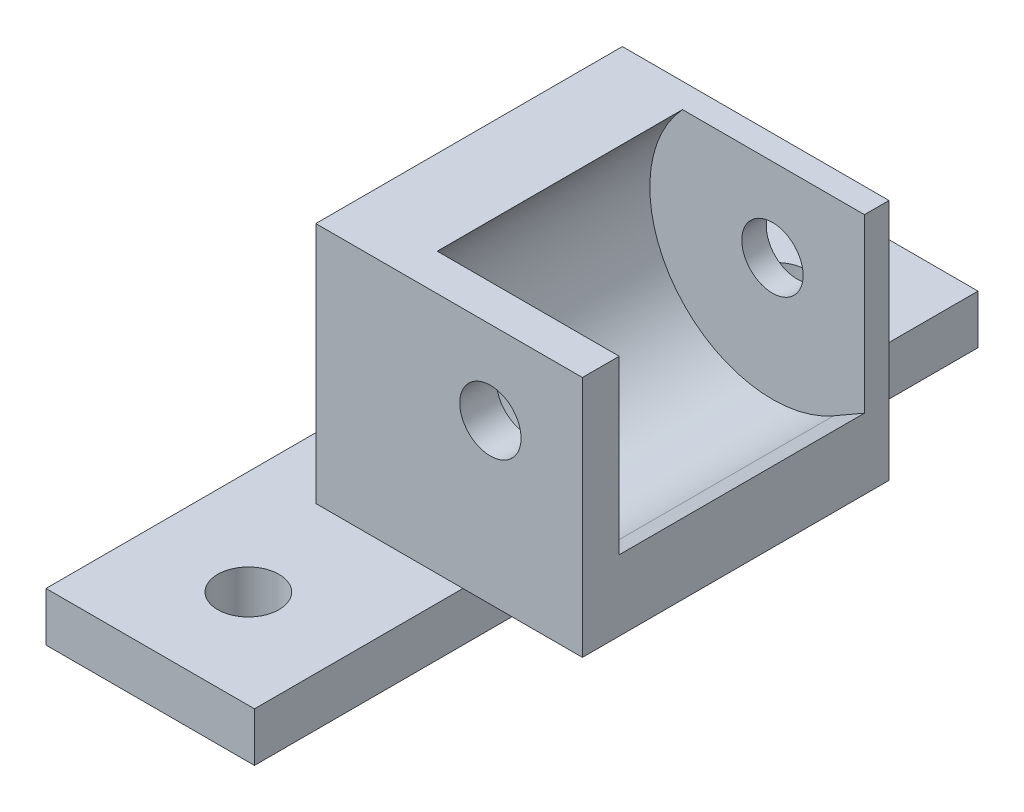
ISO-10303-21;
HEADER;
FILE_DESCRIPTION(('STEP AP214'),'2;1');
FILE_NAME('part.step','',(''),(''),'','','');
FILE_SCHEMA(('AUTOMOTIVE_DESIGN { 1 0 10303 214 1 1 1 1 }'));
ENDSEC;
DATA;
#1=APPLICATION_CONTEXT('core data for automotive mechanical design processes');
#2=APPLICATION_PROTOCOL_DEFINITION('international standard','automotive_design',2000,#1);
#3=PRODUCT_CONTEXT('',#1,'mechanical');
#4=PRODUCT('Part','Part','',(#3));
#5=PRODUCT_RELATED_PRODUCT_CATEGORY('part','',(#4));
#6=PRODUCT_DEFINITION_FORMATION('','',#4);
#7=PRODUCT_DEFINITION_CONTEXT('part definition',#1,'design');
#8=PRODUCT_DEFINITION('design','',#6,#7);
#9=PRODUCT_DEFINITION_SHAPE('','',#8);
#10=(LENGTH_UNIT() NAMED_UNIT(*) SI_UNIT(.MILLI.,.METRE.));
#11=(NAMED_UNIT(*) PLANE_ANGLE_UNIT() SI_UNIT($,.RADIAN.));
#12=(NAMED_UNIT(*) SI_UNIT($,.STERADIAN.) SOLID_ANGLE_UNIT());
#13=UNCERTAINTY_MEASURE_WITH_UNIT(LENGTH_MEASURE(1.E-05),#10,'distance_accuracy_value','');
#14=(GEOMETRIC_REPRESENTATION_CONTEXT(3) GLOBAL_UNCERTAINTY_ASSIGNED_CONTEXT((#13)) GLOBAL_UNIT_ASSIGNED_CONTEXT((#10,
#11,#12)) REPRESENTATION_CONTEXT('',''));
#15=CARTESIAN_POINT('',(0.,0.,0.));
#16=DIRECTION('',(0.,0.,1.));
#17=DIRECTION('',(1.,0.,0.));
#18=AXIS2_PLACEMENT_3D('',#15,#16,#17);
#19=CARTESIAN_POINT('',(-509.64503003972,340.,-27.94));
#20=DIRECTION('',(0.,0.,1.));
#21=DIRECTION('',(1.,0.,0.));
#22=AXIS2_PLACEMENT_3D('',#19,#20,#21);
#23=CYLINDRICAL_SURFACE('',#22,12.7);
#24=CARTESIAN_POINT('',(-509.64503003972,340.,-25.4000000000001));
#25=DIRECTION('',(0.,0.,-1.));
#26=DIRECTION('',(-1.,0.,0.));
#27=AXIS2_PLACEMENT_3D('',#24,#25,#26);
#28=CIRCLE('',#27,12.7);
#29=CARTESIAN_POINT('',(-503.315891549761,328.989459324133,-25.4000000000001));
#30=VERTEX_POINT('',#29);
#31=CARTESIAN_POINT('',(-518.959059009132,348.633589309028,-25.4000000000001));
#32=VERTEX_POINT('',#31);
#33=EDGE_CURVE('E152',#30,#32,#28,.T.);
#34=ORIENTED_EDGE('',*,*,#33,.T.);
#35=DIRECTION('',(0.,0.,1.));
#36=VECTOR('',#35,1.);
#37=CARTESIAN_POINT('',(-518.959059009132,348.633589309028,-27.94));
#38=LINE('',#37,#36);
#39=CARTESIAN_POINT('',(-518.959059009132,348.633589309028,0.));
#40=VERTEX_POINT('',#39);
#41=EDGE_CURVE('E63',#32,#40,#38,.T.);
#42=ORIENTED_EDGE('',*,*,#41,.T.);
#43=CARTESIAN_POINT('',(-509.64503003972,340.,0.));
#44=DIRECTION('',(0.,0.,1.));
#45=DIRECTION('',(1.,0.,0.));
#46=AXIS2_PLACEMENT_3D('',#43,#44,#45);
#47=CIRCLE('',#46,12.7);
#48=CARTESIAN_POINT('',(-503.315891549761,328.989459324133,0.));
#49=VERTEX_POINT('',#48);
#50=EDGE_CURVE('E126',#40,#49,#47,.T.);
#51=ORIENTED_EDGE('',*,*,#50,.T.);
#52=DIRECTION('',(0.,0.,1.));
#53=VECTOR('',#52,1.);
#54=CARTESIAN_POINT('',(-503.315891549761,328.989459324133,-27.94));
#55=LINE('',#54,#53);
#56=EDGE_CURVE('E68',#30,#49,#55,.T.);
#57=ORIENTED_EDGE('',*,*,#56,.F.);
#58=EDGE_LOOP('',(#34,#42,#51,#57));
#59=FACE_BOUND('',#58,.T.);
#60=ADVANCED_FACE('F60',(#59),#23,.F.);
#61=CARTESIAN_POINT('',(-267.1473205328,464.745153521614,-27.94));
#62=DIRECTION('',(-0.498357361414056,0.866971706761195,0.));
#63=DIRECTION('',(-0.866971706761195,-0.498357361414056,0.));
#64=AXIS2_PLACEMENT_3D('',#61,#62,#63);
#65=PLANE('',#64);
#66=DIRECTION('',(0.,0.,1.));
#67=VECTOR('',#66,1.);
#68=CARTESIAN_POINT('',(-500.115803520306,330.82895121783,-27.94));
#69=LINE('',#68,#67);
#70=CARTESIAN_POINT('',(-500.115803520306,330.82895121783,-25.4000000000001));
#71=VERTEX_POINT('',#70);
#72=CARTESIAN_POINT('',(-500.115803520306,330.82895121783,0.));
#73=VERTEX_POINT('',#72);
#74=EDGE_CURVE('E101',#71,#73,#69,.T.);
#75=ORIENTED_EDGE('',*,*,#74,.F.);
#76=DIRECTION('',(-0.866971706761204,-0.498357361414042,0.));
#77=VECTOR('',#76,1.);
#78=CARTESIAN_POINT('',(-500.115803520306,330.82895121783,-25.4000000000001));
#79=LINE('',#78,#77);
#80=EDGE_CURVE('E155',#71,#30,#79,.T.);
#81=ORIENTED_EDGE('',*,*,#80,.T.);
#82=ORIENTED_EDGE('',*,*,#56,.T.);
#83=DIRECTION('',(-0.866971706761195,-0.498357361414056,0.));
#84=VECTOR('',#83,1.);
#85=CARTESIAN_POINT('',(-267.1473205328,464.745153521614,0.));
#86=LINE('',#85,#84);
#87=EDGE_CURVE('E119',#73,#49,#86,.T.);
#88=ORIENTED_EDGE('',*,*,#87,.F.);
#89=EDGE_LOOP('',(#75,#81,#82,#88));
#90=FACE_BOUND('',#89,.T.);
#91=ADVANCED_FACE('F120',(#90),#65,.T.);
#92=CARTESIAN_POINT('',(-500.115803520306,0.,-27.94));
#93=DIRECTION('',(-1.,0.,0.));
#94=DIRECTION('',(0.,0.,1.));
#95=AXIS2_PLACEMENT_3D('',#92,#93,#94);
#96=PLANE('',#95);
#97=ORIENTED_EDGE('',*,*,#74,.T.);
#98=DIRECTION('',(0.,-1.,0.));
#99=VECTOR('',#98,1.);
#100=CARTESIAN_POINT('',(-500.115803520306,348.633589309028,0.));
#101=LINE('',#100,#99);
#102=CARTESIAN_POINT('',(-500.115803520306,348.633589309028,0.));
#103=VERTEX_POINT('',#102);
#104=EDGE_CURVE('E107',#103,#73,#101,.T.);
#105=ORIENTED_EDGE('',*,*,#104,.F.);
#106=DIRECTION('',(0.,0.,-1.));
#107=VECTOR('',#106,1.);
#108=CARTESIAN_POINT('',(-500.115803520306,348.633589309028,3.81));
#109=LINE('',#108,#107);
#110=CARTESIAN_POINT('',(-500.115803520306,348.633589309028,3.81));
#111=VERTEX_POINT('',#110);
#112=EDGE_CURVE('E142',#111,#103,#109,.T.);
#113=ORIENTED_EDGE('',*,*,#112,.F.);
#114=DIRECTION('',(0.,-1.,0.));
#115=VECTOR('',#114,1.);
#116=CARTESIAN_POINT('',(-500.115803520306,348.633589309028,3.81));
#117=LINE('',#116,#115);
#118=CARTESIAN_POINT('',(-500.115803520306,323.525975182462,3.81));
#119=VERTEX_POINT('',#118);
#120=EDGE_CURVE('E145',#111,#119,#117,.T.);
#121=ORIENTED_EDGE('',*,*,#120,.T.);
#122=DIRECTION('',(0.,0.,1.));
#123=VECTOR('',#122,1.);
#124=CARTESIAN_POINT('',(-500.115803520306,323.525975182462,-27.94));
#125=LINE('',#124,#123);
#126=CARTESIAN_POINT('',(-500.115803520306,323.525975182462,-27.94));
#127=VERTEX_POINT('',#126);
#128=EDGE_CURVE('E115',#127,#119,#125,.T.);
#129=ORIENTED_EDGE('',*,*,#128,.F.);
#130=DIRECTION('',(0.,-1.,0.));
#131=VECTOR('',#130,1.);
#132=CARTESIAN_POINT('',(-500.115803520306,0.,-27.94));
#133=LINE('',#132,#131);
#134=CARTESIAN_POINT('',(-500.115803520306,348.633589309028,-27.94));
#135=VERTEX_POINT('',#134);
#136=EDGE_CURVE('E86',#135,#127,#133,.T.);
#137=ORIENTED_EDGE('',*,*,#136,.F.);
#138=DIRECTION('',(0.,0.,1.));
#139=VECTOR('',#138,1.);
#140=CARTESIAN_POINT('',(-500.115803520306,348.633589309028,-58.7500721267847));
#141=LINE('',#140,#139);
#142=CARTESIAN_POINT('',(-500.115803520306,348.633589309028,-25.4000000000001));
#143=VERTEX_POINT('',#142);
#144=EDGE_CURVE('E148',#135,#143,#141,.T.);
#145=ORIENTED_EDGE('',*,*,#144,.T.);
#146=DIRECTION('',(0.,-1.,0.));
#147=VECTOR('',#146,1.);
#148=CARTESIAN_POINT('',(-500.115803520306,330.82895121783,-25.4000000000001));
#149=LINE('',#148,#147);
#150=EDGE_CURVE('E111',#143,#71,#149,.T.);
#151=ORIENTED_EDGE('',*,*,#150,.T.);
#152=EDGE_LOOP('',(#97,#105,#113,#121,#129,#137,#145,#151));
#153=FACE_BOUND('',#152,.T.);
#154=ADVANCED_FACE('F103',(#153),#96,.F.);
#155=CARTESIAN_POINT('',(0.,323.525975182462,-27.94));
#156=DIRECTION('',(0.,1.,0.));
#157=DIRECTION('',(0.,0.,1.));
#158=AXIS2_PLACEMENT_3D('',#155,#156,#157);
#159=PLANE('',#158);
#160=DIRECTION('',(-1.,0.,0.));
#161=VECTOR('',#160,1.);
#162=CARTESIAN_POINT('',(-500.115803520306,323.525975182462,3.81));
#163=LINE('',#162,#161);
#164=CARTESIAN_POINT('',(-512.487560082314,323.525975182462,3.80999999999999));
#165=VERTEX_POINT('',#164);
#166=EDGE_CURVE('E136',#119,#165,#163,.T.);
#167=ORIENTED_EDGE('',*,*,#166,.T.);
#168=DIRECTION('',(0.,0.,-1.));
#169=VECTOR('',#168,1.);
#170=CARTESIAN_POINT('',(-512.487560082314,323.525975182462,-49.53));
#171=LINE('',#170,#169);
#172=CARTESIAN_POINT('',(-512.487560082314,323.525975182462,-27.94));
#173=VERTEX_POINT('',#172);
#174=EDGE_CURVE('E12',#165,#173,#171,.T.);
#175=ORIENTED_EDGE('',*,*,#174,.T.);
#176=DIRECTION('',(-1.,0.,0.));
#177=VECTOR('',#176,1.);
#178=CARTESIAN_POINT('',(0.,323.525975182462,-27.94));
#179=LINE('',#178,#177);
#180=EDGE_CURVE('E166',#127,#173,#179,.T.);
#181=ORIENTED_EDGE('',*,*,#180,.F.);
#182=ORIENTED_EDGE('',*,*,#128,.T.);
#183=EDGE_LOOP('',(#167,#175,#181,#182));
#184=FACE_BOUND('',#183,.T.);
#185=ADVANCED_FACE('F308',(#184),#159,.F.);
#186=CARTESIAN_POINT('',(-527.727560082314,0.,-27.94));
#187=DIRECTION('',(1.,0.,0.));
#188=DIRECTION('',(0.,0.,-1.));
#189=AXIS2_PLACEMENT_3D('',#186,#187,#188);
#190=PLANE('',#189);
#191=DIRECTION('',(0.,0.,1.));
#192=VECTOR('',#191,1.);
#193=CARTESIAN_POINT('',(-527.727560082314,323.525975182462,-27.94));
#194=LINE('',#193,#192);
#195=CARTESIAN_POINT('',(-527.727560082314,323.525975182462,-27.94));
#196=VERTEX_POINT('',#195);
#197=CARTESIAN_POINT('',(-527.727560082314,323.525975182462,3.81));
#198=VERTEX_POINT('',#197);
#199=EDGE_CURVE('E174',#196,#198,#194,.T.);
#200=ORIENTED_EDGE('',*,*,#199,.T.);
#201=DIRECTION('',(0.,1.,0.));
#202=VECTOR('',#201,1.);
#203=CARTESIAN_POINT('',(-527.727560082314,323.525975182462,3.81));
#204=LINE('',#203,#202);
#205=CARTESIAN_POINT('',(-527.727560082314,348.633589309028,3.81));
#206=VERTEX_POINT('',#205);
#207=EDGE_CURVE('E222',#198,#206,#204,.T.);
#208=ORIENTED_EDGE('',*,*,#207,.T.);
#209=DIRECTION('',(0.,0.,1.));
#210=VECTOR('',#209,1.);
#211=CARTESIAN_POINT('',(-527.727560082314,348.633589309028,-27.94));
#212=LINE('',#211,#210);
#213=CARTESIAN_POINT('',(-527.727560082314,348.633589309028,-27.94));
#214=VERTEX_POINT('',#213);
#215=EDGE_CURVE('E176',#214,#206,#212,.T.);
#216=ORIENTED_EDGE('',*,*,#215,.F.);
#217=DIRECTION('',(0.,1.,0.));
#218=VECTOR('',#217,1.);
#219=CARTESIAN_POINT('',(-527.727560082314,0.,-27.94));
#220=LINE('',#219,#218);
#221=EDGE_CURVE('E163',#196,#214,#220,.T.);
#222=ORIENTED_EDGE('',*,*,#221,.F.);
#223=EDGE_LOOP('',(#200,#208,#216,#222));
#224=FACE_BOUND('',#223,.T.);
#225=ADVANCED_FACE('F220',(#224),#190,.F.);
#226=CARTESIAN_POINT('',(-7.00898976020188E-13,348.633589309029,-27.94));
#227=DIRECTION('',(0.,-1.,0.));
#228=DIRECTION('',(1.,0.,0.));
#229=AXIS2_PLACEMENT_3D('',#226,#227,#228);
#230=PLANE('',#229);
#231=ORIENTED_EDGE('',*,*,#215,.T.);
#232=DIRECTION('',(1.,0.,0.));
#233=VECTOR('',#232,1.);
#234=CARTESIAN_POINT('',(-527.727560082314,348.633589309028,3.81));
#235=LINE('',#234,#233);
#236=EDGE_CURVE('E190',#206,#111,#235,.T.);
#237=ORIENTED_EDGE('',*,*,#236,.T.);
#238=ORIENTED_EDGE('',*,*,#112,.T.);
#239=DIRECTION('',(1.,0.,0.));
#240=VECTOR('',#239,1.);
#241=CARTESIAN_POINT('',(-527.727560082314,348.633589309028,0.));
#242=LINE('',#241,#240);
#243=EDGE_CURVE('E131',#40,#103,#242,.T.);
#244=ORIENTED_EDGE('',*,*,#243,.F.);
#245=ORIENTED_EDGE('',*,*,#41,.F.);
#246=DIRECTION('',(1.,0.,0.));
#247=VECTOR('',#246,1.);
#248=CARTESIAN_POINT('',(-500.115803520306,348.633589309028,-25.4000000000001));
#249=LINE('',#248,#247);
#250=EDGE_CURVE('E149',#32,#143,#249,.T.);
#251=ORIENTED_EDGE('',*,*,#250,.T.);
#252=ORIENTED_EDGE('',*,*,#144,.F.);
#253=DIRECTION('',(1.,0.,0.));
#254=VECTOR('',#253,1.);
#255=CARTESIAN_POINT('',(-7.00898976020188E-13,348.633589309029,-27.94));
#256=LINE('',#255,#254);
#257=EDGE_CURVE('E125',#214,#135,#256,.T.);
#258=ORIENTED_EDGE('',*,*,#257,.F.);
#259=EDGE_LOOP('',(#231,#237,#238,#244,#245,#251,#252,#258));
#260=FACE_BOUND('',#259,.T.);
#261=ADVANCED_FACE('F188',(#260),#230,.F.);
#262=CARTESIAN_POINT('',(0.,0.,-27.94));
#263=DIRECTION('',(0.,0.,1.));
#264=DIRECTION('',(1.,0.,0.));
#265=AXIS2_PLACEMENT_3D('',#262,#263,#264);
#266=PLANE('',#265);
#267=ORIENTED_EDGE('',*,*,#257,.T.);
#268=ORIENTED_EDGE('',*,*,#136,.T.);
#269=ORIENTED_EDGE('',*,*,#180,.T.);
#270=EDGE_CURVE('E165',#173,#196,#179,.T.);
#271=ORIENTED_EDGE('',*,*,#270,.T.);
#272=ORIENTED_EDGE('',*,*,#221,.T.);
#273=EDGE_LOOP('',(#267,#268,#269,#271,#272));
#274=FACE_BOUND('',#273,.T.);
#275=CARTESIAN_POINT('',(-509.64503003972,340.,-27.94));
#276=DIRECTION('',(0.,0.,1.));
#277=DIRECTION('',(1.,0.,0.));
#278=AXIS2_PLACEMENT_3D('',#275,#276,#277);
#279=CIRCLE('',#278,3.1750000000002);
#280=CARTESIAN_POINT('',(-506.47003003972,340.,-27.94));
#281=VERTEX_POINT('',#280);
#282=EDGE_CURVE('E147',#281,#281,#279,.T.);
#283=ORIENTED_EDGE('',*,*,#282,.T.);
#284=EDGE_LOOP('',(#283));
#285=FACE_BOUND('',#284,.T.);
#286=ADVANCED_FACE('F213',(#274,#285),#266,.F.);
#287=CARTESIAN_POINT('',(-509.64503003972,340.,-25.4000000000001));
#288=DIRECTION('',(0.,0.,-1.));
#289=DIRECTION('',(-1.,0.,0.));
#290=AXIS2_PLACEMENT_3D('',#287,#288,#289);
#291=PLANE('',#290);
#292=ORIENTED_EDGE('',*,*,#80,.F.);
#293=ORIENTED_EDGE('',*,*,#150,.F.);
#294=ORIENTED_EDGE('',*,*,#250,.F.);
#295=ORIENTED_EDGE('',*,*,#33,.F.);
#296=EDGE_LOOP('',(#292,#293,#294,#295));
#297=FACE_BOUND('',#296,.T.);
#298=CARTESIAN_POINT('',(-509.64503003972,340.,-25.4000000000001));
#299=DIRECTION('',(0.,0.,-1.));
#300=DIRECTION('',(-1.,0.,0.));
#301=AXIS2_PLACEMENT_3D('',#298,#299,#300);
#302=CIRCLE('',#301,3.1750000000002);
#303=CARTESIAN_POINT('',(-512.82003003972,340.,-25.4000000000001));
#304=VERTEX_POINT('',#303);
#305=EDGE_CURVE('E144',#304,#304,#302,.T.);
#306=ORIENTED_EDGE('',*,*,#305,.T.);
#307=EDGE_LOOP('',(#306));
#308=FACE_BOUND('',#307,.T.);
#309=ADVANCED_FACE('F209',(#297,#308),#291,.F.);
#310=CARTESIAN_POINT('',(-509.64503003972,340.,-58.7500721267847));
#311=DIRECTION('',(0.,0.,1.));
#312=DIRECTION('',(1.,0.,0.));
#313=AXIS2_PLACEMENT_3D('',#310,#311,#312);
#314=CYLINDRICAL_SURFACE('',#313,3.1750000000002);
#315=ORIENTED_EDGE('',*,*,#282,.F.);
#316=EDGE_LOOP('',(#315));
#317=FACE_BOUND('',#316,.T.);
#318=ORIENTED_EDGE('',*,*,#305,.F.);
#319=EDGE_LOOP('',(#318));
#320=FACE_BOUND('',#319,.T.);
#321=ADVANCED_FACE('F348',(#317,#320),#314,.F.);
#322=CARTESIAN_POINT('',(0.,0.,0.));
#323=DIRECTION('',(0.,0.,-1.));
#324=DIRECTION('',(-1.,0.,0.));
#325=AXIS2_PLACEMENT_3D('',#322,#323,#324);
#326=PLANE('',#325);
#327=CARTESIAN_POINT('',(-509.64503003972,340.,0.));
#328=DIRECTION('',(0.,0.,1.));
#329=DIRECTION('',(1.,0.,0.));
#330=AXIS2_PLACEMENT_3D('',#327,#328,#329);
#331=CIRCLE('',#330,3.17500000000009);
#332=CARTESIAN_POINT('',(-506.47003003972,340.,0.));
#333=VERTEX_POINT('',#332);
#334=EDGE_CURVE('E230',#333,#333,#331,.T.);
#335=ORIENTED_EDGE('',*,*,#334,.T.);
#336=EDGE_LOOP('',(#335));
#337=FACE_BOUND('',#336,.T.);
#338=ORIENTED_EDGE('',*,*,#50,.F.);
#339=ORIENTED_EDGE('',*,*,#243,.T.);
#340=ORIENTED_EDGE('',*,*,#104,.T.);
#341=ORIENTED_EDGE('',*,*,#87,.T.);
#342=EDGE_LOOP('',(#338,#339,#340,#341));
#343=FACE_BOUND('',#342,.T.);
#344=ADVANCED_FACE('F129',(#337,#343),#326,.T.);
#345=CARTESIAN_POINT('',(0.,0.,3.81));
#346=DIRECTION('',(0.,0.,-1.));
#347=DIRECTION('',(-1.,0.,0.));
#348=AXIS2_PLACEMENT_3D('',#345,#346,#347);
#349=PLANE('',#348);
#350=ORIENTED_EDGE('',*,*,#166,.F.);
#351=ORIENTED_EDGE('',*,*,#120,.F.);
#352=ORIENTED_EDGE('',*,*,#236,.F.);
#353=ORIENTED_EDGE('',*,*,#207,.F.);
#354=EDGE_CURVE('E133',#165,#198,#163,.T.);
#355=ORIENTED_EDGE('',*,*,#354,.F.);
#356=EDGE_LOOP('',(#350,#351,#352,#353,#355));
#357=FACE_BOUND('',#356,.T.);
#358=CARTESIAN_POINT('',(-509.64503003972,340.,3.81));
#359=DIRECTION('',(0.,0.,1.));
#360=DIRECTION('',(1.,0.,0.));
#361=AXIS2_PLACEMENT_3D('',#358,#359,#360);
#362=CIRCLE('',#361,3.17500000000009);
#363=CARTESIAN_POINT('',(-506.47003003972,340.,3.81));
#364=VERTEX_POINT('',#363);
#365=EDGE_CURVE('E138',#364,#364,#362,.T.);
#366=ORIENTED_EDGE('',*,*,#365,.F.);
#367=EDGE_LOOP('',(#366));
#368=FACE_BOUND('',#367,.T.);
#369=ADVANCED_FACE('F305',(#357,#368),#349,.F.);
#370=CARTESIAN_POINT('',(-509.64503003972,340.,3.81));
#371=DIRECTION('',(0.,0.,-1.));
#372=DIRECTION('',(-1.,0.,0.));
#373=AXIS2_PLACEMENT_3D('',#370,#371,#372);
#374=CYLINDRICAL_SURFACE('',#373,3.17500000000009);
#375=ORIENTED_EDGE('',*,*,#365,.T.);
#376=EDGE_LOOP('',(#375));
#377=FACE_BOUND('',#376,.T.);
#378=ORIENTED_EDGE('',*,*,#334,.F.);
#379=EDGE_LOOP('',(#378));
#380=FACE_BOUND('',#379,.T.);
#381=ADVANCED_FACE('F357',(#377,#380),#374,.F.);
#382=CARTESIAN_POINT('',(-534.077560082314,318.445975182462,-49.53));
#383=DIRECTION('',(-1.,0.,0.));
#384=DIRECTION('',(0.,-1.,0.));
#385=AXIS2_PLACEMENT_3D('',#382,#383,#384);
#386=PLANE('',#385);
#387=DIRECTION('',(0.,0.,1.));
#388=VECTOR('',#387,1.);
#389=CARTESIAN_POINT('',(-534.077560082314,323.525975182462,-49.53));
#390=LINE('',#389,#388);
#391=CARTESIAN_POINT('',(-534.077560082314,323.525975182462,-49.53));
#392=VERTEX_POINT('',#391);
#393=CARTESIAN_POINT('',(-534.077560082314,323.525975182462,25.4));
#394=VERTEX_POINT('',#393);
#395=EDGE_CURVE('E255',#392,#394,#390,.T.);
#396=ORIENTED_EDGE('',*,*,#395,.F.);
#397=DIRECTION('',(0.,1.,0.));
#398=VECTOR('',#397,1.);
#399=CARTESIAN_POINT('',(-534.077560082314,318.445975182462,-49.53));
#400=LINE('',#399,#398);
#401=CARTESIAN_POINT('',(-534.077560082314,318.445975182462,-49.53));
#402=VERTEX_POINT('',#401);
#403=EDGE_CURVE('E233',#402,#392,#400,.T.);
#404=ORIENTED_EDGE('',*,*,#403,.F.);
#405=DIRECTION('',(0.,0.,1.));
#406=VECTOR('',#405,1.);
#407=CARTESIAN_POINT('',(-534.077560082314,318.445975182462,-49.53));
#408=LINE('',#407,#406);
#409=CARTESIAN_POINT('',(-534.077560082314,318.445975182462,25.4));
#410=VERTEX_POINT('',#409);
#411=EDGE_CURVE('E249',#402,#410,#408,.T.);
#412=ORIENTED_EDGE('',*,*,#411,.T.);
#413=DIRECTION('',(0.,1.,0.));
#414=VECTOR('',#413,1.);
#415=CARTESIAN_POINT('',(-534.077560082314,318.445975182462,25.4));
#416=LINE('',#415,#414);
#417=EDGE_CURVE('E236',#410,#394,#416,.T.);
#418=ORIENTED_EDGE('',*,*,#417,.T.);
#419=EDGE_LOOP('',(#396,#404,#412,#418));
#420=FACE_BOUND('',#419,.T.);
#421=ADVANCED_FACE('F320',(#420),#386,.T.);
#422=CARTESIAN_POINT('',(-534.077560082314,318.445975182462,-49.53));
#423=DIRECTION('',(0.,0.,-1.));
#424=DIRECTION('',(0.,1.,0.));
#425=AXIS2_PLACEMENT_3D('',#422,#423,#424);
#426=PLANE('',#425);
#427=DIRECTION('',(-1.,0.,0.));
#428=VECTOR('',#427,1.);
#429=CARTESIAN_POINT('',(-534.077560082314,323.525975182462,-49.53));
#430=LINE('',#429,#428);
#431=CARTESIAN_POINT('',(-512.487560082314,323.525975182462,-49.53));
#432=VERTEX_POINT('',#431);
#433=EDGE_CURVE('E247',#432,#392,#430,.T.);
#434=ORIENTED_EDGE('',*,*,#433,.F.);
#435=DIRECTION('',(0.,1.,0.));
#436=VECTOR('',#435,1.);
#437=CARTESIAN_POINT('',(-512.487560082314,318.445975182462,-49.53));
#438=LINE('',#437,#436);
#439=CARTESIAN_POINT('',(-512.487560082314,318.445975182462,-49.53));
#440=VERTEX_POINT('',#439);
#441=EDGE_CURVE('E243',#440,#432,#438,.T.);
#442=ORIENTED_EDGE('',*,*,#441,.F.);
#443=DIRECTION('',(-1.,0.,0.));
#444=VECTOR('',#443,1.);
#445=CARTESIAN_POINT('',(-534.077560082314,318.445975182462,-49.53));
#446=LINE('',#445,#444);
#447=EDGE_CURVE('E240',#440,#402,#446,.T.);
#448=ORIENTED_EDGE('',*,*,#447,.T.);
#449=ORIENTED_EDGE('',*,*,#403,.T.);
#450=EDGE_LOOP('',(#434,#442,#448,#449));
#451=FACE_BOUND('',#450,.T.);
#452=ADVANCED_FACE('F312',(#451),#426,.T.);
#453=CARTESIAN_POINT('',(-512.487560082314,318.445975182462,-49.53));
#454=DIRECTION('',(1.,0.,0.));
#455=DIRECTION('',(0.,1.,0.));
#456=AXIS2_PLACEMENT_3D('',#453,#454,#455);
#457=PLANE('',#456);
#458=CARTESIAN_POINT('',(-512.487560082314,323.525975182462,25.4));
#459=VERTEX_POINT('',#458);
#460=EDGE_CURVE('E70',#459,#165,#171,.T.);
#461=ORIENTED_EDGE('',*,*,#460,.F.);
#462=DIRECTION('',(0.,1.,0.));
#463=VECTOR('',#462,1.);
#464=CARTESIAN_POINT('',(-512.487560082314,318.445975182462,25.4));
#465=LINE('',#464,#463);
#466=CARTESIAN_POINT('',(-512.487560082314,318.445975182462,25.4));
#467=VERTEX_POINT('',#466);
#468=EDGE_CURVE('E239',#467,#459,#465,.T.);
#469=ORIENTED_EDGE('',*,*,#468,.F.);
#470=DIRECTION('',(0.,0.,-1.));
#471=VECTOR('',#470,1.);
#472=CARTESIAN_POINT('',(-512.487560082314,318.445975182462,-49.53));
#473=LINE('',#472,#471);
#474=EDGE_CURVE('E261',#467,#440,#473,.T.);
#475=ORIENTED_EDGE('',*,*,#474,.T.);
#476=ORIENTED_EDGE('',*,*,#441,.T.);
#477=EDGE_CURVE('E71',#173,#432,#171,.T.);
#478=ORIENTED_EDGE('',*,*,#477,.F.);
#479=ORIENTED_EDGE('',*,*,#174,.F.);
#480=EDGE_LOOP('',(#461,#469,#475,#476,#478,#479));
#481=FACE_BOUND('',#480,.T.);
#482=ADVANCED_FACE('F309',(#481),#457,.T.);
#483=CARTESIAN_POINT('',(-534.077560082314,318.445975182462,25.4));
#484=DIRECTION('',(0.,0.,1.));
#485=DIRECTION('',(0.,-1.,0.));
#486=AXIS2_PLACEMENT_3D('',#483,#484,#485);
#487=PLANE('',#486);
#488=DIRECTION('',(1.,0.,0.));
#489=VECTOR('',#488,1.);
#490=CARTESIAN_POINT('',(-534.077560082314,323.525975182462,25.4));
#491=LINE('',#490,#489);
#492=EDGE_CURVE('E252',#394,#459,#491,.T.);
#493=ORIENTED_EDGE('',*,*,#492,.F.);
#494=ORIENTED_EDGE('',*,*,#417,.F.);
#495=DIRECTION('',(1.,0.,0.));
#496=VECTOR('',#495,1.);
#497=CARTESIAN_POINT('',(-534.077560082314,318.445975182462,25.4));
#498=LINE('',#497,#496);
#499=EDGE_CURVE('E264',#410,#467,#498,.T.);
#500=ORIENTED_EDGE('',*,*,#499,.T.);
#501=ORIENTED_EDGE('',*,*,#468,.T.);
#502=EDGE_LOOP('',(#493,#494,#500,#501));
#503=FACE_BOUND('',#502,.T.);
#504=ADVANCED_FACE('F311',(#503),#487,.T.);
#505=CARTESIAN_POINT('',(0.,318.445975182462,-2.37882901940449E-13));
#506=DIRECTION('',(0.,1.,0.));
#507=DIRECTION('',(0.,0.,1.));
#508=AXIS2_PLACEMENT_3D('',#505,#506,#507);
#509=PLANE('',#508);
#510=CARTESIAN_POINT('',(-523.282560082314,318.445975182462,-39.37));
#511=DIRECTION('',(0.,1.,0.));
#512=DIRECTION('',(0.,0.,1.));
#513=AXIS2_PLACEMENT_3D('',#510,#511,#512);
#514=CIRCLE('',#513,3.17500000000008);
#515=CARTESIAN_POINT('',(-523.282560082314,318.445975182462,-36.1949999999999));
#516=VERTEX_POINT('',#515);
#517=EDGE_CURVE('E272',#516,#516,#514,.T.);
#518=ORIENTED_EDGE('',*,*,#517,.T.);
#519=EDGE_LOOP('',(#518));
#520=FACE_BOUND('',#519,.T.);
#521=CARTESIAN_POINT('',(-523.282560082314,318.445975182462,15.24));
#522=DIRECTION('',(0.,1.,0.));
#523=DIRECTION('',(0.,0.,1.));
#524=AXIS2_PLACEMENT_3D('',#521,#522,#523);
#525=CIRCLE('',#524,3.17500000000008);
#526=CARTESIAN_POINT('',(-523.282560082314,318.445975182462,18.4150000000001));
#527=VERTEX_POINT('',#526);
#528=EDGE_CURVE('E258',#527,#527,#525,.T.);
#529=ORIENTED_EDGE('',*,*,#528,.T.);
#530=EDGE_LOOP('',(#529));
#531=FACE_BOUND('',#530,.T.);
#532=ORIENTED_EDGE('',*,*,#411,.F.);
#533=ORIENTED_EDGE('',*,*,#447,.F.);
#534=ORIENTED_EDGE('',*,*,#474,.F.);
#535=ORIENTED_EDGE('',*,*,#499,.F.);
#536=EDGE_LOOP('',(#532,#533,#534,#535));
#537=FACE_BOUND('',#536,.T.);
#538=ADVANCED_FACE('F281',(#520,#531,#537),#509,.F.);
#539=CARTESIAN_POINT('',(0.,323.525975182462,-2.39681026766233E-13));
#540=DIRECTION('',(0.,1.,0.));
#541=DIRECTION('',(0.,0.,1.));
#542=AXIS2_PLACEMENT_3D('',#539,#540,#541);
#543=PLANE('',#542);
#544=CARTESIAN_POINT('',(-523.282560082314,323.525975182462,-39.37));
#545=DIRECTION('',(0.,1.,0.));
#546=DIRECTION('',(0.,0.,1.));
#547=AXIS2_PLACEMENT_3D('',#544,#545,#546);
#548=CIRCLE('',#547,3.17500000000008);
#549=CARTESIAN_POINT('',(-523.282560082314,323.525975182462,-36.1949999999999));
#550=VERTEX_POINT('',#549);
#551=EDGE_CURVE('E275',#550,#550,#548,.T.);
#552=ORIENTED_EDGE('',*,*,#551,.F.);
#553=EDGE_LOOP('',(#552));
#554=FACE_BOUND('',#553,.T.);
#555=CARTESIAN_POINT('',(-523.282560082314,323.525975182462,15.24));
#556=DIRECTION('',(0.,1.,0.));
#557=DIRECTION('',(0.,0.,1.));
#558=AXIS2_PLACEMENT_3D('',#555,#556,#557);
#559=CIRCLE('',#558,3.17500000000008);
#560=CARTESIAN_POINT('',(-523.282560082314,323.525975182462,18.4150000000001));
#561=VERTEX_POINT('',#560);
#562=EDGE_CURVE('E269',#561,#561,#559,.T.);
#563=ORIENTED_EDGE('',*,*,#562,.F.);
#564=EDGE_LOOP('',(#563));
#565=FACE_BOUND('',#564,.T.);
#566=ORIENTED_EDGE('',*,*,#460,.T.);
#567=ORIENTED_EDGE('',*,*,#354,.T.);
#568=ORIENTED_EDGE('',*,*,#199,.F.);
#569=ORIENTED_EDGE('',*,*,#270,.F.);
#570=ORIENTED_EDGE('',*,*,#477,.T.);
#571=ORIENTED_EDGE('',*,*,#433,.T.);
#572=ORIENTED_EDGE('',*,*,#395,.T.);
#573=ORIENTED_EDGE('',*,*,#492,.T.);
#574=EDGE_LOOP('',(#566,#567,#568,#569,#570,#571,#572,#573));
#575=FACE_BOUND('',#574,.T.);
#576=ADVANCED_FACE('F291',(#554,#565,#575),#543,.T.);
#577=CARTESIAN_POINT('',(-523.282560082314,318.445975182462,15.24));
#578=DIRECTION('',(0.,1.,0.));
#579=DIRECTION('',(0.,0.,1.));
#580=AXIS2_PLACEMENT_3D('',#577,#578,#579);
#581=CYLINDRICAL_SURFACE('',#580,3.17500000000008);
#582=ORIENTED_EDGE('',*,*,#528,.F.);
#583=EDGE_LOOP('',(#582));
#584=FACE_BOUND('',#583,.T.);
#585=ORIENTED_EDGE('',*,*,#562,.T.);
#586=EDGE_LOOP('',(#585));
#587=FACE_BOUND('',#586,.T.);
#588=ADVANCED_FACE('F287',(#584,#587),#581,.F.);
#589=CARTESIAN_POINT('',(-523.282560082314,318.445975182462,-39.37));
#590=DIRECTION('',(0.,1.,0.));
#591=DIRECTION('',(0.,0.,1.));
#592=AXIS2_PLACEMENT_3D('',#589,#590,#591);
#593=CYLINDRICAL_SURFACE('',#592,3.17500000000008);
#594=ORIENTED_EDGE('',*,*,#517,.F.);
#595=EDGE_LOOP('',(#594));
#596=FACE_BOUND('',#595,.T.);
#597=ORIENTED_EDGE('',*,*,#551,.T.);
#598=EDGE_LOOP('',(#597));
#599=FACE_BOUND('',#598,.T.);
#600=ADVANCED_FACE('F284',(#596,#599),#593,.F.);
#601=CLOSED_SHELL('',(#60,#91,#154,#185,#225,#261,#286,#309,#321,#344,#369,#381,#421,#452,#482,
#504,#538,#576,#588,#600));
#602=MANIFOLD_SOLID_BREP('B2',#601);
#603=ADVANCED_BREP_SHAPE_REPRESENTATION('',(#18,#602),#14);
#604=SHAPE_DEFINITION_REPRESENTATION(#9,#603);
ENDSEC;
END-ISO-10303-21;
